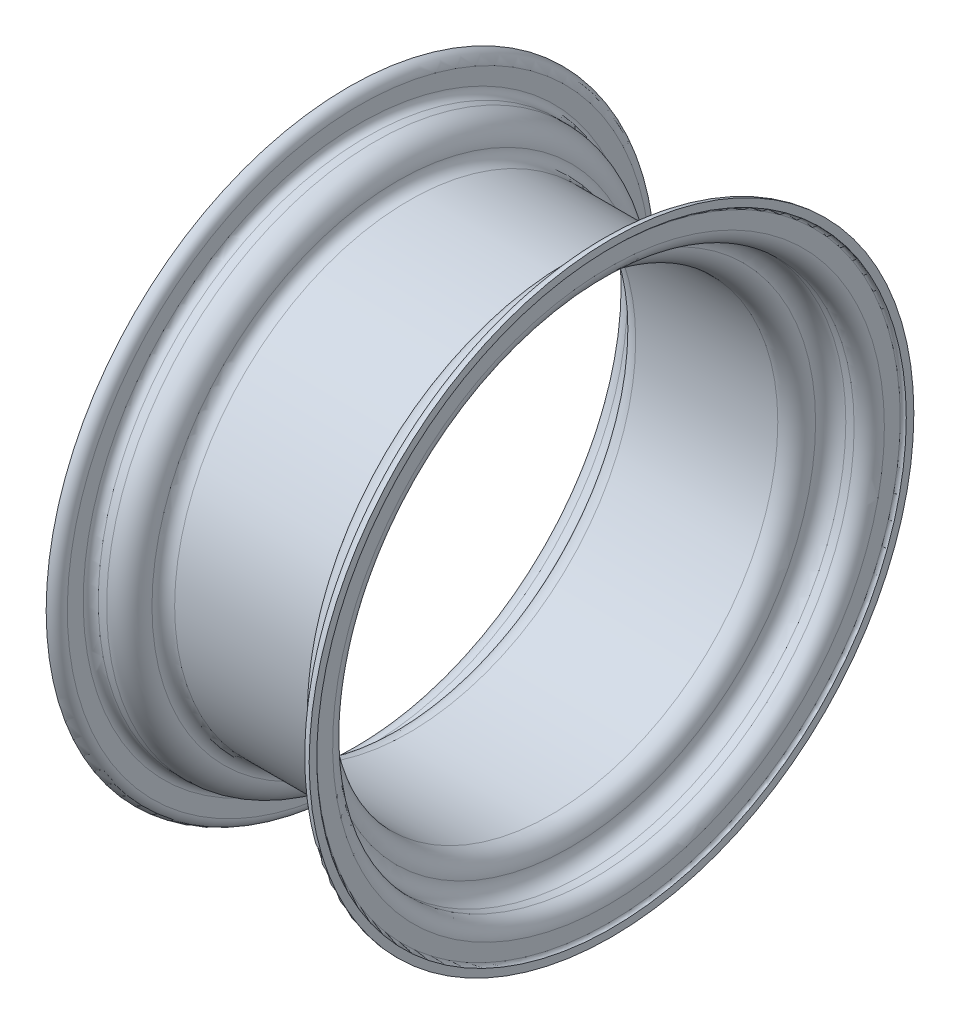
ISO-10303-21;
HEADER;
FILE_DESCRIPTION(('STEP AP214'),'2;1');
FILE_NAME('part.step','',(''),(''),'','','');
FILE_SCHEMA(('AUTOMOTIVE_DESIGN { 1 0 10303 214 1 1 1 1 }'));
ENDSEC;
DATA;
#1=APPLICATION_CONTEXT('core data for automotive mechanical design processes');
#2=APPLICATION_PROTOCOL_DEFINITION('international standard','automotive_design',2000,#1);
#3=PRODUCT_CONTEXT('',#1,'mechanical');
#4=PRODUCT('Part','Part','',(#3));
#5=PRODUCT_RELATED_PRODUCT_CATEGORY('part','',(#4));
#6=PRODUCT_DEFINITION_FORMATION('','',#4);
#7=PRODUCT_DEFINITION_CONTEXT('part definition',#1,'design');
#8=PRODUCT_DEFINITION('design','',#6,#7);
#9=PRODUCT_DEFINITION_SHAPE('','',#8);
#10=(LENGTH_UNIT() NAMED_UNIT(*) SI_UNIT(.MILLI.,.METRE.));
#11=(NAMED_UNIT(*) PLANE_ANGLE_UNIT() SI_UNIT($,.RADIAN.));
#12=(NAMED_UNIT(*) SI_UNIT($,.STERADIAN.) SOLID_ANGLE_UNIT());
#13=UNCERTAINTY_MEASURE_WITH_UNIT(LENGTH_MEASURE(1.E-05),#10,'distance_accuracy_value','');
#14=(GEOMETRIC_REPRESENTATION_CONTEXT(3) GLOBAL_UNCERTAINTY_ASSIGNED_CONTEXT((#13)) GLOBAL_UNIT_ASSIGNED_CONTEXT((#10,
#11,#12)) REPRESENTATION_CONTEXT('',''));
#15=CARTESIAN_POINT('',(0.,0.,0.));
#16=DIRECTION('',(0.,0.,1.));
#17=DIRECTION('',(1.,0.,0.));
#18=AXIS2_PLACEMENT_3D('',#15,#16,#17);
#19=CARTESIAN_POINT('',(-95.7,0.,0.));
#20=DIRECTION('',(1.,0.,0.));
#21=DIRECTION('',(0.,0.,-1.));
#22=AXIS2_PLACEMENT_3D('',#19,#20,#21);
#23=CYLINDRICAL_SURFACE('',#22,150.);
#24=CARTESIAN_POINT('',(47.,0.,0.));
#25=DIRECTION('',(1.,0.,0.));
#26=DIRECTION('',(0.,0.,-1.));
#27=AXIS2_PLACEMENT_3D('',#24,#25,#26);
#28=CIRCLE('',#27,150.);
#29=CARTESIAN_POINT('',(47.,0.,-150.));
#30=VERTEX_POINT('',#29);
#31=EDGE_CURVE('E364',#30,#30,#28,.F.);
#32=ORIENTED_EDGE('',*,*,#31,.F.);
#33=EDGE_LOOP('',(#32));
#34=FACE_BOUND('',#33,.T.);
#35=CARTESIAN_POINT('',(-47.,0.,0.));
#36=DIRECTION('',(1.,0.,0.));
#37=DIRECTION('',(0.,0.,-1.));
#38=AXIS2_PLACEMENT_3D('',#35,#36,#37);
#39=CIRCLE('',#38,150.);
#40=CARTESIAN_POINT('',(-47.,0.,-150.));
#41=VERTEX_POINT('',#40);
#42=EDGE_CURVE('E370',#41,#41,#39,.T.);
#43=ORIENTED_EDGE('',*,*,#42,.F.);
#44=EDGE_LOOP('',(#43));
#45=FACE_BOUND('',#44,.T.);
#46=ADVANCED_FACE('F23',(#34,#45),#23,.F.);
#47=CARTESIAN_POINT('',(-47.,0.,0.));
#48=DIRECTION('',(1.,0.,0.));
#49=DIRECTION('',(0.,0.,-1.));
#50=AXIS2_PLACEMENT_3D('',#47,#48,#49);
#51=TOROIDAL_SURFACE('',#50,162.5,12.5);
#52=CARTESIAN_POINT('',(-59.5,0.,0.));
#53=DIRECTION('',(1.,0.,0.));
#54=DIRECTION('',(0.,0.,-1.));
#55=AXIS2_PLACEMENT_3D('',#52,#53,#54);
#56=CIRCLE('',#55,162.5);
#57=CARTESIAN_POINT('',(-59.5,0.,-162.5));
#58=VERTEX_POINT('',#57);
#59=EDGE_CURVE('E361',#58,#58,#56,.F.);
#60=ORIENTED_EDGE('',*,*,#59,.T.);
#61=EDGE_LOOP('',(#60));
#62=FACE_BOUND('',#61,.T.);
#63=ORIENTED_EDGE('',*,*,#42,.T.);
#64=EDGE_LOOP('',(#63));
#65=FACE_BOUND('',#64,.T.);
#66=ADVANCED_FACE('F376',(#62,#65),#51,.T.);
#67=CARTESIAN_POINT('',(47.,0.,0.));
#68=DIRECTION('',(1.,0.,0.));
#69=DIRECTION('',(0.,0.,-1.));
#70=AXIS2_PLACEMENT_3D('',#67,#68,#69);
#71=TOROIDAL_SURFACE('',#70,162.5,12.5);
#72=ORIENTED_EDGE('',*,*,#31,.T.);
#73=EDGE_LOOP('',(#72));
#74=FACE_BOUND('',#73,.T.);
#75=CARTESIAN_POINT('',(59.5,0.,0.));
#76=DIRECTION('',(1.,0.,0.));
#77=DIRECTION('',(0.,0.,-1.));
#78=AXIS2_PLACEMENT_3D('',#75,#76,#77);
#79=CIRCLE('',#78,162.5);
#80=CARTESIAN_POINT('',(59.5,0.,-162.5));
#81=VERTEX_POINT('',#80);
#82=EDGE_CURVE('E339',#81,#81,#79,.T.);
#83=ORIENTED_EDGE('',*,*,#82,.T.);
#84=EDGE_LOOP('',(#83));
#85=FACE_BOUND('',#84,.T.);
#86=ADVANCED_FACE('F355',(#74,#85),#71,.T.);
#87=CARTESIAN_POINT('',(-69.5,0.,0.));
#88=DIRECTION('',(1.,0.,0.));
#89=DIRECTION('',(0.,0.,-1.));
#90=AXIS2_PLACEMENT_3D('',#87,#88,#89);
#91=TOROIDAL_SURFACE('',#90,162.5,10.);
#92=ORIENTED_EDGE('',*,*,#59,.F.);
#93=EDGE_LOOP('',(#92));
#94=FACE_BOUND('',#93,.T.);
#95=CARTESIAN_POINT('',(-69.5,0.,0.));
#96=DIRECTION('',(1.,0.,0.));
#97=DIRECTION('',(0.,0.,-1.));
#98=AXIS2_PLACEMENT_3D('',#95,#96,#97);
#99=CIRCLE('',#98,172.5);
#100=CARTESIAN_POINT('',(-69.5,0.,-172.5));
#101=VERTEX_POINT('',#100);
#102=EDGE_CURVE('E334',#101,#101,#99,.F.);
#103=ORIENTED_EDGE('',*,*,#102,.T.);
#104=EDGE_LOOP('',(#103));
#105=FACE_BOUND('',#104,.T.);
#106=ADVANCED_FACE('F350',(#94,#105),#91,.F.);
#107=CARTESIAN_POINT('',(69.5,0.,0.));
#108=DIRECTION('',(1.,0.,0.));
#109=DIRECTION('',(0.,0.,-1.));
#110=AXIS2_PLACEMENT_3D('',#107,#108,#109);
#111=TOROIDAL_SURFACE('',#110,162.5,10.);
#112=CARTESIAN_POINT('',(69.5,0.,0.));
#113=DIRECTION('',(1.,0.,0.));
#114=DIRECTION('',(0.,0.,-1.));
#115=AXIS2_PLACEMENT_3D('',#112,#113,#114);
#116=CIRCLE('',#115,172.5);
#117=CARTESIAN_POINT('',(69.5,0.,-172.5));
#118=VERTEX_POINT('',#117);
#119=EDGE_CURVE('E326',#118,#118,#116,.T.);
#120=ORIENTED_EDGE('',*,*,#119,.T.);
#121=EDGE_LOOP('',(#120));
#122=FACE_BOUND('',#121,.T.);
#123=ORIENTED_EDGE('',*,*,#82,.F.);
#124=EDGE_LOOP('',(#123));
#125=FACE_BOUND('',#124,.T.);
#126=ADVANCED_FACE('F346',(#122,#125),#111,.F.);
#127=CARTESIAN_POINT('',(-95.7,0.,0.));
#128=DIRECTION('',(1.,0.,0.));
#129=DIRECTION('',(0.,0.,-1.));
#130=AXIS2_PLACEMENT_3D('',#127,#128,#129);
#131=CYLINDRICAL_SURFACE('',#130,172.5);
#132=CARTESIAN_POINT('',(-75.,0.,0.));
#133=DIRECTION('',(1.,0.,0.));
#134=DIRECTION('',(0.,0.,-1.));
#135=AXIS2_PLACEMENT_3D('',#132,#133,#134);
#136=CIRCLE('',#135,172.5);
#137=CARTESIAN_POINT('',(-75.,0.,-172.5));
#138=VERTEX_POINT('',#137);
#139=EDGE_CURVE('E294',#138,#138,#136,.T.);
#140=ORIENTED_EDGE('',*,*,#139,.F.);
#141=EDGE_LOOP('',(#140));
#142=FACE_BOUND('',#141,.T.);
#143=ORIENTED_EDGE('',*,*,#102,.F.);
#144=EDGE_LOOP('',(#143));
#145=FACE_BOUND('',#144,.T.);
#146=ADVANCED_FACE('F349',(#142,#145),#131,.F.);
#147=CARTESIAN_POINT('',(-95.7,0.,0.));
#148=DIRECTION('',(1.,0.,0.));
#149=DIRECTION('',(0.,0.,-1.));
#150=AXIS2_PLACEMENT_3D('',#147,#148,#149);
#151=CYLINDRICAL_SURFACE('',#150,172.5);
#152=ORIENTED_EDGE('',*,*,#119,.F.);
#153=EDGE_LOOP('',(#152));
#154=FACE_BOUND('',#153,.T.);
#155=CARTESIAN_POINT('',(75.,0.,0.));
#156=DIRECTION('',(1.,0.,0.));
#157=DIRECTION('',(0.,0.,-1.));
#158=AXIS2_PLACEMENT_3D('',#155,#156,#157);
#159=CIRCLE('',#158,172.5);
#160=CARTESIAN_POINT('',(75.,0.,-172.5));
#161=VERTEX_POINT('',#160);
#162=EDGE_CURVE('E290',#161,#161,#159,.F.);
#163=ORIENTED_EDGE('',*,*,#162,.F.);
#164=EDGE_LOOP('',(#163));
#165=FACE_BOUND('',#164,.T.);
#166=ADVANCED_FACE('F317',(#154,#165),#151,.F.);
#167=CARTESIAN_POINT('',(-75.,0.,0.));
#168=DIRECTION('',(1.,0.,0.));
#169=DIRECTION('',(0.,0.,-1.));
#170=AXIS2_PLACEMENT_3D('',#167,#168,#169);
#171=TOROIDAL_SURFACE('',#170,182.5,10.);
#172=ORIENTED_EDGE('',*,*,#139,.T.);
#173=EDGE_LOOP('',(#172));
#174=FACE_BOUND('',#173,.T.);
#175=CARTESIAN_POINT('',(-85.,0.,0.));
#176=DIRECTION('',(-1.,0.,0.));
#177=DIRECTION('',(0.,-1.,0.));
#178=AXIS2_PLACEMENT_3D('',#175,#176,#177);
#179=CIRCLE('',#178,182.5);
#180=CARTESIAN_POINT('',(-85.,-182.5,0.));
#181=VERTEX_POINT('',#180);
#182=EDGE_CURVE('E293',#181,#181,#179,.T.);
#183=ORIENTED_EDGE('',*,*,#182,.T.);
#184=EDGE_LOOP('',(#183));
#185=FACE_BOUND('',#184,.T.);
#186=ADVANCED_FACE('F313',(#174,#185),#171,.T.);
#187=CARTESIAN_POINT('',(75.,0.,0.));
#188=DIRECTION('',(1.,0.,0.));
#189=DIRECTION('',(0.,0.,-1.));
#190=AXIS2_PLACEMENT_3D('',#187,#188,#189);
#191=TOROIDAL_SURFACE('',#190,182.5,10.);
#192=ORIENTED_EDGE('',*,*,#162,.T.);
#193=EDGE_LOOP('',(#192));
#194=FACE_BOUND('',#193,.T.);
#195=CARTESIAN_POINT('',(85.,0.,0.));
#196=DIRECTION('',(1.,0.,0.));
#197=DIRECTION('',(0.,-1.,0.));
#198=AXIS2_PLACEMENT_3D('',#195,#196,#197);
#199=CIRCLE('',#198,182.5);
#200=CARTESIAN_POINT('',(85.,-182.5,0.));
#201=VERTEX_POINT('',#200);
#202=EDGE_CURVE('E301',#201,#201,#199,.F.);
#203=ORIENTED_EDGE('',*,*,#202,.F.);
#204=EDGE_LOOP('',(#203));
#205=FACE_BOUND('',#204,.T.);
#206=ADVANCED_FACE('F264',(#194,#205),#191,.T.);
#207=CARTESIAN_POINT('',(-85.,0.,0.));
#208=DIRECTION('',(1.,0.,0.));
#209=DIRECTION('',(0.,0.,-1.));
#210=AXIS2_PLACEMENT_3D('',#207,#208,#209);
#211=PLANE('',#210);
#212=ORIENTED_EDGE('',*,*,#182,.F.);
#213=EDGE_LOOP('',(#212));
#214=FACE_BOUND('',#213,.T.);
#215=CARTESIAN_POINT('',(-85.,0.,0.));
#216=DIRECTION('',(1.,0.,0.));
#217=DIRECTION('',(0.,-1.,0.));
#218=AXIS2_PLACEMENT_3D('',#215,#216,#217);
#219=CIRCLE('',#218,193.);
#220=CARTESIAN_POINT('',(-85.,-193.,0.));
#221=VERTEX_POINT('',#220);
#222=EDGE_CURVE('E247',#221,#221,#219,.F.);
#223=ORIENTED_EDGE('',*,*,#222,.T.);
#224=EDGE_LOOP('',(#223));
#225=FACE_BOUND('',#224,.T.);
#226=ADVANCED_FACE('F254',(#214,#225),#211,.F.);
#227=CARTESIAN_POINT('',(85.,0.,0.));
#228=DIRECTION('',(1.,0.,0.));
#229=DIRECTION('',(0.,0.,-1.));
#230=AXIS2_PLACEMENT_3D('',#227,#228,#229);
#231=PLANE('',#230);
#232=ORIENTED_EDGE('',*,*,#202,.T.);
#233=EDGE_LOOP('',(#232));
#234=FACE_BOUND('',#233,.T.);
#235=CARTESIAN_POINT('',(85.,0.,0.));
#236=DIRECTION('',(-1.,0.,0.));
#237=DIRECTION('',(0.,-1.,0.));
#238=AXIS2_PLACEMENT_3D('',#235,#236,#237);
#239=CIRCLE('',#238,193.);
#240=CARTESIAN_POINT('',(85.,-193.,0.));
#241=VERTEX_POINT('',#240);
#242=EDGE_CURVE('E592',#241,#241,#239,.F.);
#243=ORIENTED_EDGE('',*,*,#242,.T.);
#244=EDGE_LOOP('',(#243));
#245=FACE_BOUND('',#244,.T.);
#246=ADVANCED_FACE('F263',(#234,#245),#231,.T.);
#247=CARTESIAN_POINT('',(-87.,0.,0.));
#248=DIRECTION('',(1.,0.,0.));
#249=DIRECTION('',(0.,0.,-1.));
#250=AXIS2_PLACEMENT_3D('',#247,#248,#249);
#251=TOROIDAL_SURFACE('',#250,193.,2.);
#252=CARTESIAN_POINT('',(-87.,0.,0.));
#253=DIRECTION('',(1.,0.,0.));
#254=DIRECTION('',(0.,0.,-1.));
#255=AXIS2_PLACEMENT_3D('',#252,#253,#254);
#256=CIRCLE('',#255,195.);
#257=CARTESIAN_POINT('',(-87.,0.,-195.));
#258=VERTEX_POINT('',#257);
#259=EDGE_CURVE('E26',#258,#258,#256,.F.);
#260=ORIENTED_EDGE('',*,*,#259,.T.);
#261=EDGE_LOOP('',(#260));
#262=FACE_BOUND('',#261,.T.);
#263=ORIENTED_EDGE('',*,*,#222,.F.);
#264=EDGE_LOOP('',(#263));
#265=FACE_BOUND('',#264,.T.);
#266=ADVANCED_FACE('F227',(#262,#265),#251,.F.);
#267=CARTESIAN_POINT('',(87.,0.,0.));
#268=DIRECTION('',(1.,0.,0.));
#269=DIRECTION('',(0.,0.,-1.));
#270=AXIS2_PLACEMENT_3D('',#267,#268,#269);
#271=TOROIDAL_SURFACE('',#270,193.,2.);
#272=ORIENTED_EDGE('',*,*,#242,.F.);
#273=EDGE_LOOP('',(#272));
#274=FACE_BOUND('',#273,.T.);
#275=CARTESIAN_POINT('',(87.,0.,0.));
#276=DIRECTION('',(1.,0.,0.));
#277=DIRECTION('',(0.,0.,-1.));
#278=AXIS2_PLACEMENT_3D('',#275,#276,#277);
#279=CIRCLE('',#278,195.);
#280=CARTESIAN_POINT('',(87.,0.,-195.));
#281=VERTEX_POINT('',#280);
#282=EDGE_CURVE('E596',#281,#281,#279,.F.);
#283=ORIENTED_EDGE('',*,*,#282,.F.);
#284=EDGE_LOOP('',(#283));
#285=FACE_BOUND('',#284,.T.);
#286=ADVANCED_FACE('F221',(#274,#285),#271,.F.);
#287=CARTESIAN_POINT('',(-87.,0.,0.));
#288=DIRECTION('',(1.,0.,0.));
#289=DIRECTION('',(0.,0.,-1.));
#290=AXIS2_PLACEMENT_3D('',#287,#288,#289);
#291=PLANE('',#290);
#292=ORIENTED_EDGE('',*,*,#259,.F.);
#293=EDGE_LOOP('',(#292));
#294=FACE_BOUND('',#293,.T.);
#295=CARTESIAN_POINT('',(-87.,0.,0.));
#296=DIRECTION('',(1.,0.,0.));
#297=DIRECTION('',(0.,0.,-1.));
#298=AXIS2_PLACEMENT_3D('',#295,#296,#297);
#299=CIRCLE('',#298,200.);
#300=CARTESIAN_POINT('',(-87.,0.,-200.));
#301=VERTEX_POINT('',#300);
#302=EDGE_CURVE('E599',#301,#301,#299,.T.);
#303=ORIENTED_EDGE('',*,*,#302,.F.);
#304=EDGE_LOOP('',(#303));
#305=FACE_BOUND('',#304,.T.);
#306=ADVANCED_FACE('F226',(#294,#305),#291,.F.);
#307=CARTESIAN_POINT('',(87.,0.,0.));
#308=DIRECTION('',(1.,0.,0.));
#309=DIRECTION('',(0.,0.,-1.));
#310=AXIS2_PLACEMENT_3D('',#307,#308,#309);
#311=PLANE('',#310);
#312=ORIENTED_EDGE('',*,*,#282,.T.);
#313=EDGE_LOOP('',(#312));
#314=FACE_BOUND('',#313,.T.);
#315=CARTESIAN_POINT('',(87.,0.,0.));
#316=DIRECTION('',(1.,0.,0.));
#317=DIRECTION('',(0.,0.,-1.));
#318=AXIS2_PLACEMENT_3D('',#315,#316,#317);
#319=CIRCLE('',#318,200.);
#320=CARTESIAN_POINT('',(87.,0.,-200.));
#321=VERTEX_POINT('',#320);
#322=EDGE_CURVE('E602',#321,#321,#319,.F.);
#323=ORIENTED_EDGE('',*,*,#322,.F.);
#324=EDGE_LOOP('',(#323));
#325=FACE_BOUND('',#324,.T.);
#326=ADVANCED_FACE('F450',(#314,#325),#311,.T.);
#327=CARTESIAN_POINT('',(-87.,0.,0.));
#328=DIRECTION('',(1.,0.,0.));
#329=DIRECTION('',(0.,0.,-1.));
#330=AXIS2_PLACEMENT_3D('',#327,#328,#329);
#331=TOROIDAL_SURFACE('',#330,193.,7.);
#332=CARTESIAN_POINT('',(-80.,0.,0.));
#333=DIRECTION('',(-1.,0.,0.));
#334=DIRECTION('',(0.,-1.,0.));
#335=AXIS2_PLACEMENT_3D('',#332,#333,#334);
#336=CIRCLE('',#335,193.);
#337=CARTESIAN_POINT('',(-80.,-193.,0.));
#338=VERTEX_POINT('',#337);
#339=EDGE_CURVE('E153',#338,#338,#336,.F.);
#340=ORIENTED_EDGE('',*,*,#339,.F.);
#341=EDGE_LOOP('',(#340));
#342=FACE_BOUND('',#341,.T.);
#343=ORIENTED_EDGE('',*,*,#302,.T.);
#344=EDGE_LOOP('',(#343));
#345=FACE_BOUND('',#344,.T.);
#346=ADVANCED_FACE('F192',(#342,#345),#331,.T.);
#347=CARTESIAN_POINT('',(87.,0.,0.));
#348=DIRECTION('',(1.,0.,0.));
#349=DIRECTION('',(0.,0.,-1.));
#350=AXIS2_PLACEMENT_3D('',#347,#348,#349);
#351=TOROIDAL_SURFACE('',#350,193.,7.);
#352=ORIENTED_EDGE('',*,*,#322,.T.);
#353=EDGE_LOOP('',(#352));
#354=FACE_BOUND('',#353,.T.);
#355=CARTESIAN_POINT('',(80.,0.,0.));
#356=DIRECTION('',(1.,0.,0.));
#357=DIRECTION('',(0.,-1.,0.));
#358=AXIS2_PLACEMENT_3D('',#355,#356,#357);
#359=CIRCLE('',#358,193.);
#360=CARTESIAN_POINT('',(80.,-193.,0.));
#361=VERTEX_POINT('',#360);
#362=EDGE_CURVE('E111',#361,#361,#359,.T.);
#363=ORIENTED_EDGE('',*,*,#362,.T.);
#364=EDGE_LOOP('',(#363));
#365=FACE_BOUND('',#364,.T.);
#366=ADVANCED_FACE('F188',(#354,#365),#351,.T.);
#367=CARTESIAN_POINT('',(-80.,0.,0.));
#368=DIRECTION('',(1.,0.,0.));
#369=DIRECTION('',(0.,0.,-1.));
#370=AXIS2_PLACEMENT_3D('',#367,#368,#369);
#371=PLANE('',#370);
#372=CARTESIAN_POINT('',(-80.,0.,0.));
#373=DIRECTION('',(1.,0.,0.));
#374=DIRECTION('',(0.,-1.,0.));
#375=AXIS2_PLACEMENT_3D('',#372,#373,#374);
#376=CIRCLE('',#375,182.5);
#377=CARTESIAN_POINT('',(-80.,-182.5,0.));
#378=VERTEX_POINT('',#377);
#379=EDGE_CURVE('E166',#378,#378,#376,.F.);
#380=ORIENTED_EDGE('',*,*,#379,.T.);
#381=EDGE_LOOP('',(#380));
#382=FACE_BOUND('',#381,.T.);
#383=ORIENTED_EDGE('',*,*,#339,.T.);
#384=EDGE_LOOP('',(#383));
#385=FACE_BOUND('',#384,.T.);
#386=ADVANCED_FACE('F126',(#382,#385),#371,.T.);
#387=CARTESIAN_POINT('',(80.,0.,0.));
#388=DIRECTION('',(1.,0.,0.));
#389=DIRECTION('',(0.,0.,-1.));
#390=AXIS2_PLACEMENT_3D('',#387,#388,#389);
#391=PLANE('',#390);
#392=CARTESIAN_POINT('',(80.,0.,0.));
#393=DIRECTION('',(-1.,0.,0.));
#394=DIRECTION('',(0.,-1.,0.));
#395=AXIS2_PLACEMENT_3D('',#392,#393,#394);
#396=CIRCLE('',#395,182.5);
#397=CARTESIAN_POINT('',(80.,-182.5,0.));
#398=VERTEX_POINT('',#397);
#399=EDGE_CURVE('E140',#398,#398,#396,.F.);
#400=ORIENTED_EDGE('',*,*,#399,.T.);
#401=EDGE_LOOP('',(#400));
#402=FACE_BOUND('',#401,.T.);
#403=ORIENTED_EDGE('',*,*,#362,.F.);
#404=EDGE_LOOP('',(#403));
#405=FACE_BOUND('',#404,.T.);
#406=ADVANCED_FACE('F117',(#402,#405),#391,.F.);
#407=CARTESIAN_POINT('',(-75.,0.,0.));
#408=DIRECTION('',(1.,0.,0.));
#409=DIRECTION('',(0.,0.,-1.));
#410=AXIS2_PLACEMENT_3D('',#407,#408,#409);
#411=TOROIDAL_SURFACE('',#410,182.5,5.);
#412=CARTESIAN_POINT('',(-75.,0.,0.));
#413=DIRECTION('',(1.,0.,0.));
#414=DIRECTION('',(0.,0.,-1.));
#415=AXIS2_PLACEMENT_3D('',#412,#413,#414);
#416=CIRCLE('',#415,177.5);
#417=CARTESIAN_POINT('',(-75.,0.,-177.5));
#418=VERTEX_POINT('',#417);
#419=EDGE_CURVE('E609',#418,#418,#416,.T.);
#420=ORIENTED_EDGE('',*,*,#419,.F.);
#421=EDGE_LOOP('',(#420));
#422=FACE_BOUND('',#421,.T.);
#423=ORIENTED_EDGE('',*,*,#379,.F.);
#424=EDGE_LOOP('',(#423));
#425=FACE_BOUND('',#424,.T.);
#426=ADVANCED_FACE('F95',(#422,#425),#411,.F.);
#427=CARTESIAN_POINT('',(75.,0.,0.));
#428=DIRECTION('',(1.,0.,0.));
#429=DIRECTION('',(0.,0.,-1.));
#430=AXIS2_PLACEMENT_3D('',#427,#428,#429);
#431=TOROIDAL_SURFACE('',#430,182.5,5.);
#432=ORIENTED_EDGE('',*,*,#399,.F.);
#433=EDGE_LOOP('',(#432));
#434=FACE_BOUND('',#433,.T.);
#435=CARTESIAN_POINT('',(75.,0.,0.));
#436=DIRECTION('',(1.,0.,0.));
#437=DIRECTION('',(0.,0.,-1.));
#438=AXIS2_PLACEMENT_3D('',#435,#436,#437);
#439=CIRCLE('',#438,177.5);
#440=CARTESIAN_POINT('',(75.,0.,-177.5));
#441=VERTEX_POINT('',#440);
#442=EDGE_CURVE('E611',#441,#441,#439,.F.);
#443=ORIENTED_EDGE('',*,*,#442,.F.);
#444=EDGE_LOOP('',(#443));
#445=FACE_BOUND('',#444,.T.);
#446=ADVANCED_FACE('F89',(#434,#445),#431,.F.);
#447=CARTESIAN_POINT('',(-95.7,0.,0.));
#448=DIRECTION('',(1.,0.,0.));
#449=DIRECTION('',(0.,0.,-1.));
#450=AXIS2_PLACEMENT_3D('',#447,#448,#449);
#451=CYLINDRICAL_SURFACE('',#450,177.5);
#452=ORIENTED_EDGE('',*,*,#419,.T.);
#453=EDGE_LOOP('',(#452));
#454=FACE_BOUND('',#453,.T.);
#455=CARTESIAN_POINT('',(-69.5,0.,0.));
#456=DIRECTION('',(1.,0.,0.));
#457=DIRECTION('',(0.,0.,-1.));
#458=AXIS2_PLACEMENT_3D('',#455,#456,#457);
#459=CIRCLE('',#458,177.5);
#460=CARTESIAN_POINT('',(-69.5,0.,-177.5));
#461=VERTEX_POINT('',#460);
#462=EDGE_CURVE('E72',#461,#461,#459,.T.);
#463=ORIENTED_EDGE('',*,*,#462,.F.);
#464=EDGE_LOOP('',(#463));
#465=FACE_BOUND('',#464,.T.);
#466=ADVANCED_FACE('F85',(#454,#465),#451,.T.);
#467=CARTESIAN_POINT('',(-95.7,0.,0.));
#468=DIRECTION('',(1.,0.,0.));
#469=DIRECTION('',(0.,0.,-1.));
#470=AXIS2_PLACEMENT_3D('',#467,#468,#469);
#471=CYLINDRICAL_SURFACE('',#470,177.5);
#472=CARTESIAN_POINT('',(69.5,0.,0.));
#473=DIRECTION('',(1.,0.,0.));
#474=DIRECTION('',(0.,0.,-1.));
#475=AXIS2_PLACEMENT_3D('',#472,#473,#474);
#476=CIRCLE('',#475,177.5);
#477=CARTESIAN_POINT('',(69.5,0.,-177.5));
#478=VERTEX_POINT('',#477);
#479=EDGE_CURVE('E66',#478,#478,#476,.F.);
#480=ORIENTED_EDGE('',*,*,#479,.F.);
#481=EDGE_LOOP('',(#480));
#482=FACE_BOUND('',#481,.T.);
#483=ORIENTED_EDGE('',*,*,#442,.T.);
#484=EDGE_LOOP('',(#483));
#485=FACE_BOUND('',#484,.T.);
#486=ADVANCED_FACE('F81',(#482,#485),#471,.T.);
#487=CARTESIAN_POINT('',(-69.5,0.,0.));
#488=DIRECTION('',(1.,0.,0.));
#489=DIRECTION('',(0.,0.,-1.));
#490=AXIS2_PLACEMENT_3D('',#487,#488,#489);
#491=TOROIDAL_SURFACE('',#490,162.5,15.);
#492=CARTESIAN_POINT('',(-54.5,0.,0.));
#493=DIRECTION('',(1.,0.,0.));
#494=DIRECTION('',(0.,0.,-1.));
#495=AXIS2_PLACEMENT_3D('',#492,#493,#494);
#496=CIRCLE('',#495,162.5);
#497=CARTESIAN_POINT('',(-54.5,0.,-162.5));
#498=VERTEX_POINT('',#497);
#499=EDGE_CURVE('E63',#498,#498,#496,.F.);
#500=ORIENTED_EDGE('',*,*,#499,.T.);
#501=EDGE_LOOP('',(#500));
#502=FACE_BOUND('',#501,.T.);
#503=ORIENTED_EDGE('',*,*,#462,.T.);
#504=EDGE_LOOP('',(#503));
#505=FACE_BOUND('',#504,.T.);
#506=ADVANCED_FACE('F78',(#502,#505),#491,.T.);
#507=CARTESIAN_POINT('',(69.5,0.,0.));
#508=DIRECTION('',(1.,0.,0.));
#509=DIRECTION('',(0.,0.,-1.));
#510=AXIS2_PLACEMENT_3D('',#507,#508,#509);
#511=TOROIDAL_SURFACE('',#510,162.5,15.);
#512=ORIENTED_EDGE('',*,*,#479,.T.);
#513=EDGE_LOOP('',(#512));
#514=FACE_BOUND('',#513,.T.);
#515=CARTESIAN_POINT('',(54.5,0.,0.));
#516=DIRECTION('',(1.,0.,0.));
#517=DIRECTION('',(0.,0.,-1.));
#518=AXIS2_PLACEMENT_3D('',#515,#516,#517);
#519=CIRCLE('',#518,162.5);
#520=CARTESIAN_POINT('',(54.5,0.,-162.5));
#521=VERTEX_POINT('',#520);
#522=EDGE_CURVE('E35',#521,#521,#519,.T.);
#523=ORIENTED_EDGE('',*,*,#522,.T.);
#524=EDGE_LOOP('',(#523));
#525=FACE_BOUND('',#524,.T.);
#526=ADVANCED_FACE('F56',(#514,#525),#511,.T.);
#527=CARTESIAN_POINT('',(-47.,0.,0.));
#528=DIRECTION('',(1.,0.,0.));
#529=DIRECTION('',(0.,0.,-1.));
#530=AXIS2_PLACEMENT_3D('',#527,#528,#529);
#531=TOROIDAL_SURFACE('',#530,162.5,7.5);
#532=ORIENTED_EDGE('',*,*,#499,.F.);
#533=EDGE_LOOP('',(#532));
#534=FACE_BOUND('',#533,.T.);
#535=CARTESIAN_POINT('',(-47.,0.,0.));
#536=DIRECTION('',(1.,0.,0.));
#537=DIRECTION('',(0.,0.,-1.));
#538=AXIS2_PLACEMENT_3D('',#535,#536,#537);
#539=CIRCLE('',#538,155.);
#540=CARTESIAN_POINT('',(-47.,0.,-155.));
#541=VERTEX_POINT('',#540);
#542=EDGE_CURVE('E30',#541,#541,#539,.T.);
#543=ORIENTED_EDGE('',*,*,#542,.F.);
#544=EDGE_LOOP('',(#543));
#545=FACE_BOUND('',#544,.T.);
#546=ADVANCED_FACE('F51',(#534,#545),#531,.F.);
#547=CARTESIAN_POINT('',(47.,0.,0.));
#548=DIRECTION('',(1.,0.,0.));
#549=DIRECTION('',(0.,0.,-1.));
#550=AXIS2_PLACEMENT_3D('',#547,#548,#549);
#551=TOROIDAL_SURFACE('',#550,162.5,7.5);
#552=CARTESIAN_POINT('',(47.,0.,0.));
#553=DIRECTION('',(1.,0.,0.));
#554=DIRECTION('',(0.,0.,-1.));
#555=AXIS2_PLACEMENT_3D('',#552,#553,#554);
#556=CIRCLE('',#555,155.);
#557=CARTESIAN_POINT('',(47.,0.,-155.));
#558=VERTEX_POINT('',#557);
#559=EDGE_CURVE('E12',#558,#558,#556,.F.);
#560=ORIENTED_EDGE('',*,*,#559,.F.);
#561=EDGE_LOOP('',(#560));
#562=FACE_BOUND('',#561,.T.);
#563=ORIENTED_EDGE('',*,*,#522,.F.);
#564=EDGE_LOOP('',(#563));
#565=FACE_BOUND('',#564,.T.);
#566=ADVANCED_FACE('F46',(#562,#565),#551,.F.);
#567=CARTESIAN_POINT('',(-95.7,0.,0.));
#568=DIRECTION('',(1.,0.,0.));
#569=DIRECTION('',(0.,0.,-1.));
#570=AXIS2_PLACEMENT_3D('',#567,#568,#569);
#571=CYLINDRICAL_SURFACE('',#570,155.);
#572=ORIENTED_EDGE('',*,*,#559,.T.);
#573=EDGE_LOOP('',(#572));
#574=FACE_BOUND('',#573,.T.);
#575=ORIENTED_EDGE('',*,*,#542,.T.);
#576=EDGE_LOOP('',(#575));
#577=FACE_BOUND('',#576,.T.);
#578=ADVANCED_FACE('F50',(#574,#577),#571,.T.);
#579=CLOSED_SHELL('',(#46,#66,#86,#106,#126,#146,#166,#186,#206,#226,#246,#266,#286,#306,#326,
#346,#366,#386,#406,#426,#446,#466,#486,#506,#526,#546,#566,#578));
#580=MANIFOLD_SOLID_BREP('B1',#579);
#581=ADVANCED_BREP_SHAPE_REPRESENTATION('',(#18,#580),#14);
#582=SHAPE_DEFINITION_REPRESENTATION(#9,#581);
ENDSEC;
END-ISO-10303-21;
